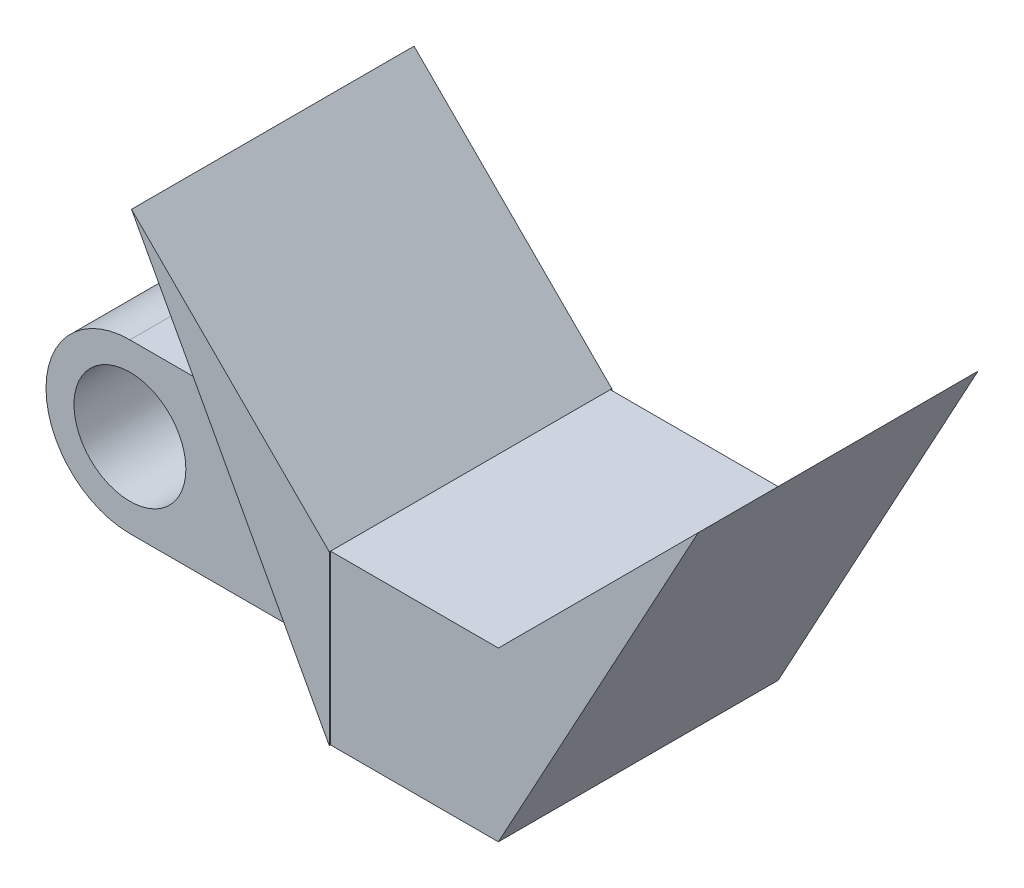
ISO-10303-21;
HEADER;
FILE_DESCRIPTION(('STEP AP214'),'2;1');
FILE_NAME('part.step','',(''),(''),'','','');
FILE_SCHEMA(('AUTOMOTIVE_DESIGN { 1 0 10303 214 1 1 1 1 }'));
ENDSEC;
DATA;
#1=APPLICATION_CONTEXT('core data for automotive mechanical design processes');
#2=APPLICATION_PROTOCOL_DEFINITION('international standard','automotive_design',2000,#1);
#3=PRODUCT_CONTEXT('',#1,'mechanical');
#4=PRODUCT('Part','Part','',(#3));
#5=PRODUCT_RELATED_PRODUCT_CATEGORY('part','',(#4));
#6=PRODUCT_DEFINITION_FORMATION('','',#4);
#7=PRODUCT_DEFINITION_CONTEXT('part definition',#1,'design');
#8=PRODUCT_DEFINITION('design','',#6,#7);
#9=PRODUCT_DEFINITION_SHAPE('','',#8);
#10=(LENGTH_UNIT() NAMED_UNIT(*) SI_UNIT(.MILLI.,.METRE.));
#11=(NAMED_UNIT(*) PLANE_ANGLE_UNIT() SI_UNIT($,.RADIAN.));
#12=(NAMED_UNIT(*) SI_UNIT($,.STERADIAN.) SOLID_ANGLE_UNIT());
#13=UNCERTAINTY_MEASURE_WITH_UNIT(LENGTH_MEASURE(1.E-05),#10,'distance_accuracy_value','');
#14=(GEOMETRIC_REPRESENTATION_CONTEXT(3) GLOBAL_UNCERTAINTY_ASSIGNED_CONTEXT((#13)) GLOBAL_UNIT_ASSIGNED_CONTEXT((#10,
#11,#12)) REPRESENTATION_CONTEXT('',''));
#15=CARTESIAN_POINT('',(0.,0.,0.));
#16=DIRECTION('',(0.,0.,1.));
#17=DIRECTION('',(1.,0.,0.));
#18=AXIS2_PLACEMENT_3D('',#15,#16,#17);
#19=CARTESIAN_POINT('',(6.98523526445291,0.879215927798923,8.72748724976806));
#20=DIRECTION('',(0.,0.,1.));
#21=DIRECTION('',(1.,0.,0.));
#22=AXIS2_PLACEMENT_3D('',#19,#20,#21);
#23=PLANE('',#22);
#24=CARTESIAN_POINT('',(6.98523526445291,0.879215927798923,8.72748724976806));
#25=DIRECTION('',(0.,0.,1.));
#26=DIRECTION('',(1.,0.,0.));
#27=AXIS2_PLACEMENT_3D('',#24,#25,#26);
#28=CIRCLE('',#27,3.75);
#29=CARTESIAN_POINT('',(10.7352352644529,0.879215927798923,8.72748724976806));
#30=VERTEX_POINT('',#29);
#31=EDGE_CURVE('E249',#30,#30,#28,.T.);
#32=ORIENTED_EDGE('',*,*,#31,.F.);
#33=EDGE_LOOP('',(#32));
#34=FACE_BOUND('',#33,.T.);
#35=DIRECTION('',(1.,0.,0.));
#36=VECTOR('',#35,1.);
#37=CARTESIAN_POINT('',(6.98523526445291,-4.74578407220108,8.72748724976806));
#38=LINE('',#37,#36);
#39=CARTESIAN_POINT('',(6.98523526445291,-4.74578407220108,8.72748724976806));
#40=VERTEX_POINT('',#39);
#41=CARTESIAN_POINT('',(25.9745803355988,-4.74578407220108,8.72748724976806));
#42=VERTEX_POINT('',#41);
#43=EDGE_CURVE('E264',#40,#42,#38,.T.);
#44=ORIENTED_EDGE('',*,*,#43,.T.);
#45=DIRECTION('',(-0.475809965540265,0.879548109367857,0.));
#46=VECTOR('',#45,1.);
#47=CARTESIAN_POINT('',(19.321435341387,7.55274165196021,8.72748724976806));
#48=LINE('',#47,#46);
#49=CARTESIAN_POINT('',(19.8886572856645,6.50421592779892,8.72748724976806));
#50=VERTEX_POINT('',#49);
#51=EDGE_CURVE('E68',#42,#50,#48,.T.);
#52=ORIENTED_EDGE('',*,*,#51,.T.);
#53=DIRECTION('',(-1.,0.,0.));
#54=VECTOR('',#53,1.);
#55=CARTESIAN_POINT('',(29.4852352644529,6.50421592779892,8.72748724976806));
#56=LINE('',#55,#54);
#57=CARTESIAN_POINT('',(6.98523526445291,6.50421592779892,8.72748724976806));
#58=VERTEX_POINT('',#57);
#59=EDGE_CURVE('E257',#50,#58,#56,.T.);
#60=ORIENTED_EDGE('',*,*,#59,.T.);
#61=CARTESIAN_POINT('',(6.98523526445291,0.879215927798923,8.72748724976806));
#62=DIRECTION('',(0.,0.,1.));
#63=DIRECTION('',(1.,0.,0.));
#64=AXIS2_PLACEMENT_3D('',#61,#62,#63);
#65=CIRCLE('',#64,5.625);
#66=EDGE_CURVE('E260',#58,#40,#65,.T.);
#67=ORIENTED_EDGE('',*,*,#66,.T.);
#68=EDGE_LOOP('',(#44,#52,#60,#67));
#69=FACE_BOUND('',#68,.T.);
#70=ADVANCED_FACE('F44',(#34,#69),#23,.T.);
#71=CARTESIAN_POINT('',(6.98523526445291,0.879215927798923,1.22748724976807));
#72=DIRECTION('',(0.,0.,1.));
#73=DIRECTION('',(1.,0.,0.));
#74=AXIS2_PLACEMENT_3D('',#71,#72,#73);
#75=PLANE('',#74);
#76=CARTESIAN_POINT('',(6.98523526445291,0.879215927798923,1.22748724976807));
#77=DIRECTION('',(0.,0.,1.));
#78=DIRECTION('',(1.,0.,0.));
#79=AXIS2_PLACEMENT_3D('',#76,#77,#78);
#80=CIRCLE('',#79,3.75);
#81=CARTESIAN_POINT('',(10.7352352644529,0.879215927798923,1.22748724976807));
#82=VERTEX_POINT('',#81);
#83=EDGE_CURVE('E245',#82,#82,#80,.T.);
#84=ORIENTED_EDGE('',*,*,#83,.T.);
#85=EDGE_LOOP('',(#84));
#86=FACE_BOUND('',#85,.T.);
#87=DIRECTION('',(-0.475809965540265,0.879548109367857,0.));
#88=VECTOR('',#87,1.);
#89=CARTESIAN_POINT('',(19.321435341387,7.55274165196021,1.22748724976807));
#90=LINE('',#89,#88);
#91=CARTESIAN_POINT('',(25.9745803355988,-4.74578407220108,1.22748724976807));
#92=VERTEX_POINT('',#91);
#93=CARTESIAN_POINT('',(19.8886572856645,6.50421592779892,1.22748724976807));
#94=VERTEX_POINT('',#93);
#95=EDGE_CURVE('E186',#92,#94,#90,.T.);
#96=ORIENTED_EDGE('',*,*,#95,.F.);
#97=DIRECTION('',(1.,0.,0.));
#98=VECTOR('',#97,1.);
#99=CARTESIAN_POINT('',(29.4852352644529,-4.74578407220108,1.22748724976807));
#100=LINE('',#99,#98);
#101=CARTESIAN_POINT('',(6.98523526445291,-4.74578407220108,1.22748724976807));
#102=VERTEX_POINT('',#101);
#103=EDGE_CURVE('E261',#102,#92,#100,.T.);
#104=ORIENTED_EDGE('',*,*,#103,.F.);
#105=CARTESIAN_POINT('',(6.98523526445291,0.879215927798923,1.22748724976807));
#106=DIRECTION('',(0.,0.,1.));
#107=DIRECTION('',(1.,0.,0.));
#108=AXIS2_PLACEMENT_3D('',#105,#106,#107);
#109=CIRCLE('',#108,5.625);
#110=CARTESIAN_POINT('',(6.98523526445291,6.50421592779892,1.22748724976807));
#111=VERTEX_POINT('',#110);
#112=EDGE_CURVE('E269',#111,#102,#109,.T.);
#113=ORIENTED_EDGE('',*,*,#112,.F.);
#114=DIRECTION('',(-1.,0.,0.));
#115=VECTOR('',#114,1.);
#116=CARTESIAN_POINT('',(6.98523526445291,6.50421592779892,1.22748724976807));
#117=LINE('',#116,#115);
#118=EDGE_CURVE('E253',#94,#111,#117,.T.);
#119=ORIENTED_EDGE('',*,*,#118,.F.);
#120=EDGE_LOOP('',(#96,#104,#113,#119));
#121=FACE_BOUND('',#120,.T.);
#122=ADVANCED_FACE('F289',(#86,#121),#75,.F.);
#123=CARTESIAN_POINT('',(6.98523526445291,6.50421592779892,8.72748724976806));
#124=DIRECTION('',(0.,-1.,0.));
#125=DIRECTION('',(0.,0.,-1.));
#126=AXIS2_PLACEMENT_3D('',#123,#124,#125);
#127=PLANE('',#126);
#128=DIRECTION('',(0.,0.,1.));
#129=VECTOR('',#128,1.);
#130=CARTESIAN_POINT('',(19.8886572856645,6.50421592779892,8.72748724976806));
#131=LINE('',#130,#129);
#132=EDGE_CURVE('E60',#94,#50,#131,.T.);
#133=ORIENTED_EDGE('',*,*,#132,.F.);
#134=ORIENTED_EDGE('',*,*,#118,.T.);
#135=DIRECTION('',(0.,0.,-1.));
#136=VECTOR('',#135,1.);
#137=CARTESIAN_POINT('',(6.98523526445291,6.50421592779892,8.72748724976806));
#138=LINE('',#137,#136);
#139=EDGE_CURVE('E11',#58,#111,#138,.T.);
#140=ORIENTED_EDGE('',*,*,#139,.F.);
#141=ORIENTED_EDGE('',*,*,#59,.F.);
#142=EDGE_LOOP('',(#133,#134,#140,#141));
#143=FACE_BOUND('',#142,.T.);
#144=ADVANCED_FACE('F46',(#143),#127,.F.);
#145=DIRECTION('',(0.,0.,-1.));
#146=VECTOR('',#145,1.);
#147=CARTESIAN_POINT('',(25.9745803355988,6.50421592779893,14.2699872497681));
#148=LINE('',#147,#146);
#149=CARTESIAN_POINT('',(25.9745803355988,6.50421592779893,14.2699872497681));
#150=VERTEX_POINT('',#149);
#151=CARTESIAN_POINT('',(25.9745803355988,6.50421592779893,-4.48001275023193));
#152=VERTEX_POINT('',#151);
#153=EDGE_CURVE('E212',#150,#152,#148,.T.);
#154=ORIENTED_EDGE('',*,*,#153,.F.);
#155=DIRECTION('',(-1.,0.,0.));
#156=VECTOR('',#155,1.);
#157=CARTESIAN_POINT('',(25.9745803355988,6.50421592779893,14.2699872497681));
#158=LINE('',#157,#156);
#159=CARTESIAN_POINT('',(37.2245803355988,6.50421592779893,14.2699872497681));
#160=VERTEX_POINT('',#159);
#161=EDGE_CURVE('E225',#160,#150,#158,.T.);
#162=ORIENTED_EDGE('',*,*,#161,.F.);
#163=DIRECTION('',(0.,0.,1.));
#164=VECTOR('',#163,1.);
#165=CARTESIAN_POINT('',(37.2245803355988,6.50421592779893,14.2699872497681));
#166=LINE('',#165,#164);
#167=CARTESIAN_POINT('',(37.2245803355988,6.50421592779893,-4.48001275023193));
#168=VERTEX_POINT('',#167);
#169=EDGE_CURVE('E221',#168,#160,#166,.T.);
#170=ORIENTED_EDGE('',*,*,#169,.F.);
#171=DIRECTION('',(1.,0.,0.));
#172=VECTOR('',#171,1.);
#173=CARTESIAN_POINT('',(25.9745803355988,6.50421592779893,-4.48001275023193));
#174=LINE('',#173,#172);
#175=EDGE_CURVE('E216',#152,#168,#174,.T.);
#176=ORIENTED_EDGE('',*,*,#175,.F.);
#177=EDGE_LOOP('',(#154,#162,#170,#176));
#178=FACE_BOUND('',#177,.T.);
#179=ADVANCED_FACE('F303',(#178),#127,.F.);
#180=CARTESIAN_POINT('',(6.98523526445291,0.879215927798923,8.72748724976806));
#181=DIRECTION('',(0.,0.,-1.));
#182=DIRECTION('',(-1.,0.,0.));
#183=AXIS2_PLACEMENT_3D('',#180,#181,#182);
#184=CYLINDRICAL_SURFACE('',#183,5.625);
#185=ORIENTED_EDGE('',*,*,#112,.T.);
#186=DIRECTION('',(0.,0.,-1.));
#187=VECTOR('',#186,1.);
#188=CARTESIAN_POINT('',(6.98523526445291,-4.74578407220108,8.72748724976806));
#189=LINE('',#188,#187);
#190=EDGE_CURVE('E53',#40,#102,#189,.T.);
#191=ORIENTED_EDGE('',*,*,#190,.F.);
#192=ORIENTED_EDGE('',*,*,#66,.F.);
#193=ORIENTED_EDGE('',*,*,#139,.T.);
#194=EDGE_LOOP('',(#185,#191,#192,#193));
#195=FACE_BOUND('',#194,.T.);
#196=ADVANCED_FACE('F285',(#195),#184,.T.);
#197=CARTESIAN_POINT('',(29.4852352644529,-4.74578407220108,8.72748724976806));
#198=DIRECTION('',(0.,1.,0.));
#199=DIRECTION('',(0.,0.,1.));
#200=AXIS2_PLACEMENT_3D('',#197,#198,#199);
#201=PLANE('',#200);
#202=DIRECTION('',(0.,0.,-1.));
#203=VECTOR('',#202,1.);
#204=CARTESIAN_POINT('',(25.9745803355988,-4.74578407220108,14.2699872497681));
#205=LINE('',#204,#203);
#206=CARTESIAN_POINT('',(25.9745803355988,-4.74578407220108,14.2699872497681));
#207=VERTEX_POINT('',#206);
#208=EDGE_CURVE('E142',#207,#42,#205,.T.);
#209=ORIENTED_EDGE('',*,*,#208,.T.);
#210=ORIENTED_EDGE('',*,*,#43,.F.);
#211=ORIENTED_EDGE('',*,*,#190,.T.);
#212=ORIENTED_EDGE('',*,*,#103,.T.);
#213=CARTESIAN_POINT('',(25.9745803355988,-4.74578407220108,-4.48001275023193));
#214=VERTEX_POINT('',#213);
#215=EDGE_CURVE('E211',#92,#214,#205,.T.);
#216=ORIENTED_EDGE('',*,*,#215,.T.);
#217=DIRECTION('',(1.,0.,0.));
#218=VECTOR('',#217,1.);
#219=CARTESIAN_POINT('',(25.9745803355988,-4.74578407220108,-4.48001275023193));
#220=LINE('',#219,#218);
#221=CARTESIAN_POINT('',(37.2245803355988,-4.74578407220108,-4.48001275023193));
#222=VERTEX_POINT('',#221);
#223=EDGE_CURVE('E232',#214,#222,#220,.T.);
#224=ORIENTED_EDGE('',*,*,#223,.T.);
#225=DIRECTION('',(0.,0.,1.));
#226=VECTOR('',#225,1.);
#227=CARTESIAN_POINT('',(37.2245803355988,-4.74578407220108,14.2699872497681));
#228=LINE('',#227,#226);
#229=CARTESIAN_POINT('',(37.2245803355988,-4.74578407220108,14.2699872497681));
#230=VERTEX_POINT('',#229);
#231=EDGE_CURVE('E235',#222,#230,#228,.T.);
#232=ORIENTED_EDGE('',*,*,#231,.T.);
#233=DIRECTION('',(-1.,0.,0.));
#234=VECTOR('',#233,1.);
#235=CARTESIAN_POINT('',(25.9745803355988,-4.74578407220108,14.2699872497681));
#236=LINE('',#235,#234);
#237=EDGE_CURVE('E217',#230,#207,#236,.T.);
#238=ORIENTED_EDGE('',*,*,#237,.T.);
#239=EDGE_LOOP('',(#209,#210,#211,#212,#216,#224,#232,#238));
#240=FACE_BOUND('',#239,.T.);
#241=ADVANCED_FACE('F280',(#240),#201,.F.);
#242=CARTESIAN_POINT('',(6.98523526445291,0.879215927798923,8.72748724976806));
#243=DIRECTION('',(0.,0.,-1.));
#244=DIRECTION('',(-1.,0.,0.));
#245=AXIS2_PLACEMENT_3D('',#242,#243,#244);
#246=CYLINDRICAL_SURFACE('',#245,3.75);
#247=ORIENTED_EDGE('',*,*,#31,.T.);
#248=EDGE_LOOP('',(#247));
#249=FACE_BOUND('',#248,.T.);
#250=ORIENTED_EDGE('',*,*,#83,.F.);
#251=EDGE_LOOP('',(#250));
#252=FACE_BOUND('',#251,.T.);
#253=ADVANCED_FACE('F327',(#249,#252),#246,.F.);
#254=CARTESIAN_POINT('',(25.9745803355988,6.50421592779893,14.2699872497681));
#255=DIRECTION('',(0.,0.,1.));
#256=DIRECTION('',(1.,0.,0.));
#257=AXIS2_PLACEMENT_3D('',#254,#255,#256);
#258=PLANE('',#257);
#259=ORIENTED_EDGE('',*,*,#237,.F.);
#260=DIRECTION('',(-0.477595392948132,-0.878579899971949,0.));
#261=VECTOR('',#260,1.);
#262=CARTESIAN_POINT('',(50.6239712760256,19.9036068682256,14.2699872497681));
#263=LINE('',#262,#261);
#264=CARTESIAN_POINT('',(50.6239712760256,19.9036068682256,14.2699872497681));
#265=VERTEX_POINT('',#264);
#266=EDGE_CURVE('E197',#265,#230,#263,.T.);
#267=ORIENTED_EDGE('',*,*,#266,.F.);
#268=DIRECTION('',(0.707106781186551,0.707106781186544,0.));
#269=VECTOR('',#268,1.);
#270=CARTESIAN_POINT('',(37.2245803355988,6.50421592779893,14.2699872497681));
#271=LINE('',#270,#269);
#272=EDGE_CURVE('E193',#160,#265,#271,.T.);
#273=ORIENTED_EDGE('',*,*,#272,.F.);
#274=ORIENTED_EDGE('',*,*,#161,.T.);
#275=DIRECTION('',(0.,-1.,0.));
#276=VECTOR('',#275,1.);
#277=CARTESIAN_POINT('',(25.9745803355988,6.50421592779893,14.2699872497681));
#278=LINE('',#277,#276);
#279=EDGE_CURVE('E242',#150,#207,#278,.T.);
#280=ORIENTED_EDGE('',*,*,#279,.T.);
#281=EDGE_LOOP('',(#259,#267,#273,#274,#280));
#282=FACE_BOUND('',#281,.T.);
#283=ADVANCED_FACE('F417',(#282),#258,.T.);
#284=CARTESIAN_POINT('',(25.9745803355988,6.50421592779893,-4.48001275023193));
#285=DIRECTION('',(0.,0.,-1.));
#286=DIRECTION('',(-1.,0.,0.));
#287=AXIS2_PLACEMENT_3D('',#284,#285,#286);
#288=PLANE('',#287);
#289=ORIENTED_EDGE('',*,*,#223,.F.);
#290=DIRECTION('',(0.,-1.,0.));
#291=VECTOR('',#290,1.);
#292=CARTESIAN_POINT('',(25.9745803355988,6.50421592779893,-4.48001275023193));
#293=LINE('',#292,#291);
#294=EDGE_CURVE('E229',#152,#214,#293,.T.);
#295=ORIENTED_EDGE('',*,*,#294,.F.);
#296=ORIENTED_EDGE('',*,*,#175,.T.);
#297=DIRECTION('',(0.707106781186551,0.707106781186544,0.));
#298=VECTOR('',#297,1.);
#299=CARTESIAN_POINT('',(37.2245803355988,6.50421592779893,-4.48001275023193));
#300=LINE('',#299,#298);
#301=CARTESIAN_POINT('',(50.6239712760256,19.9036068682256,-4.48001275023193));
#302=VERTEX_POINT('',#301);
#303=EDGE_CURVE('E192',#168,#302,#300,.T.);
#304=ORIENTED_EDGE('',*,*,#303,.T.);
#305=DIRECTION('',(-0.477595392948132,-0.878579899971949,0.));
#306=VECTOR('',#305,1.);
#307=CARTESIAN_POINT('',(50.6239712760256,19.9036068682256,-4.48001275023193));
#308=LINE('',#307,#306);
#309=EDGE_CURVE('E198',#302,#222,#308,.T.);
#310=ORIENTED_EDGE('',*,*,#309,.T.);
#311=EDGE_LOOP('',(#289,#295,#296,#304,#310));
#312=FACE_BOUND('',#311,.T.);
#313=ADVANCED_FACE('F300',(#312),#288,.T.);
#314=CARTESIAN_POINT('',(50.6239712760256,19.9036068682256,14.2699872497681));
#315=DIRECTION('',(0.878579899971949,-0.477595392948132,0.));
#316=DIRECTION('',(0.477595392948132,0.878579899971949,0.));
#317=AXIS2_PLACEMENT_3D('',#314,#315,#316);
#318=PLANE('',#317);
#319=ORIENTED_EDGE('',*,*,#309,.F.);
#320=DIRECTION('',(0.,0.,-1.));
#321=VECTOR('',#320,1.);
#322=CARTESIAN_POINT('',(50.6239712760256,19.9036068682256,14.2699872497681));
#323=LINE('',#322,#321);
#324=EDGE_CURVE('E202',#265,#302,#323,.T.);
#325=ORIENTED_EDGE('',*,*,#324,.F.);
#326=ORIENTED_EDGE('',*,*,#266,.T.);
#327=ORIENTED_EDGE('',*,*,#231,.F.);
#328=EDGE_LOOP('',(#319,#325,#326,#327));
#329=FACE_BOUND('',#328,.T.);
#330=ADVANCED_FACE('F416',(#329),#318,.T.);
#331=CARTESIAN_POINT('',(37.2245803355988,6.50421592779893,14.2699872497681));
#332=DIRECTION('',(-0.707106781186544,0.707106781186551,0.));
#333=DIRECTION('',(-0.707106781186551,-0.707106781186544,0.));
#334=AXIS2_PLACEMENT_3D('',#331,#332,#333);
#335=PLANE('',#334);
#336=ORIENTED_EDGE('',*,*,#303,.F.);
#337=ORIENTED_EDGE('',*,*,#169,.T.);
#338=ORIENTED_EDGE('',*,*,#272,.T.);
#339=ORIENTED_EDGE('',*,*,#324,.T.);
#340=EDGE_LOOP('',(#336,#337,#338,#339));
#341=FACE_BOUND('',#340,.T.);
#342=ADVANCED_FACE('F390',(#341),#335,.T.);
#343=CARTESIAN_POINT('',(25.9745803355988,6.50421592779893,-4.58501275023194));
#344=DIRECTION('',(-1.,0.,0.));
#345=DIRECTION('',(0.,0.,1.));
#346=AXIS2_PLACEMENT_3D('',#343,#344,#345);
#347=PLANE('',#346);
#348=ORIENTED_EDGE('',*,*,#279,.F.);
#349=DIRECTION('',(0.,0.,1.));
#350=VECTOR('',#349,1.);
#351=CARTESIAN_POINT('',(25.9745803355988,6.50421592779893,-4.58501275023194));
#352=LINE('',#351,#350);
#353=CARTESIAN_POINT('',(25.9745803355988,6.50421592779893,14.3524872497681));
#354=VERTEX_POINT('',#353);
#355=EDGE_CURVE('E160',#150,#354,#352,.T.);
#356=ORIENTED_EDGE('',*,*,#355,.T.);
#357=DIRECTION('',(0.,-1.,0.));
#358=VECTOR('',#357,1.);
#359=CARTESIAN_POINT('',(25.9745803355988,6.50421592779893,14.3524872497681));
#360=LINE('',#359,#358);
#361=CARTESIAN_POINT('',(25.9745803355988,-4.74578407220108,14.3524872497681));
#362=VERTEX_POINT('',#361);
#363=EDGE_CURVE('E153',#354,#362,#360,.T.);
#364=ORIENTED_EDGE('',*,*,#363,.T.);
#365=DIRECTION('',(0.,0.,1.));
#366=VECTOR('',#365,1.);
#367=CARTESIAN_POINT('',(25.9745803355988,-4.74578407220108,-4.58501275023194));
#368=LINE('',#367,#366);
#369=EDGE_CURVE('E135',#207,#362,#368,.T.);
#370=ORIENTED_EDGE('',*,*,#369,.F.);
#371=EDGE_LOOP('',(#348,#356,#364,#370));
#372=FACE_BOUND('',#371,.T.);
#373=ADVANCED_FACE('F158',(#372),#347,.F.);
#374=ORIENTED_EDGE('',*,*,#294,.T.);
#375=CARTESIAN_POINT('',(25.9745803355988,-4.74578407220108,-4.58501275023194));
#376=VERTEX_POINT('',#375);
#377=EDGE_CURVE('E147',#376,#214,#368,.T.);
#378=ORIENTED_EDGE('',*,*,#377,.F.);
#379=DIRECTION('',(0.,-1.,0.));
#380=VECTOR('',#379,1.);
#381=CARTESIAN_POINT('',(25.9745803355988,6.50421592779893,-4.58501275023194));
#382=LINE('',#381,#380);
#383=CARTESIAN_POINT('',(25.9745803355988,6.50421592779893,-4.58501275023194));
#384=VERTEX_POINT('',#383);
#385=EDGE_CURVE('E166',#384,#376,#382,.T.);
#386=ORIENTED_EDGE('',*,*,#385,.F.);
#387=EDGE_CURVE('E176',#384,#152,#352,.T.);
#388=ORIENTED_EDGE('',*,*,#387,.T.);
#389=EDGE_LOOP('',(#374,#378,#386,#388));
#390=FACE_BOUND('',#389,.T.);
#391=ADVANCED_FACE('F295',(#390),#347,.F.);
#392=CARTESIAN_POINT('',(12.7163281883511,19.7624680750467,-4.58501275023194));
#393=DIRECTION('',(0.879548109367857,0.475809965540265,0.));
#394=DIRECTION('',(-0.475809965540265,0.879548109367857,0.));
#395=AXIS2_PLACEMENT_3D('',#392,#393,#394);
#396=PLANE('',#395);
#397=ORIENTED_EDGE('',*,*,#51,.F.);
#398=ORIENTED_EDGE('',*,*,#208,.F.);
#399=ORIENTED_EDGE('',*,*,#369,.T.);
#400=DIRECTION('',(-0.475809965540265,0.879548109367857,0.));
#401=VECTOR('',#400,1.);
#402=CARTESIAN_POINT('',(12.7163281883511,19.7624680750467,14.3524872497681));
#403=LINE('',#402,#401);
#404=CARTESIAN_POINT('',(12.7163281883511,19.7624680750467,14.3524872497681));
#405=VERTEX_POINT('',#404);
#406=EDGE_CURVE('E139',#362,#405,#403,.T.);
#407=ORIENTED_EDGE('',*,*,#406,.T.);
#408=DIRECTION('',(0.,0.,1.));
#409=VECTOR('',#408,1.);
#410=CARTESIAN_POINT('',(12.7163281883511,19.7624680750467,-4.58501275023194));
#411=LINE('',#410,#409);
#412=CARTESIAN_POINT('',(12.7163281883511,19.7624680750467,-4.58501275023194));
#413=VERTEX_POINT('',#412);
#414=EDGE_CURVE('E148',#413,#405,#411,.T.);
#415=ORIENTED_EDGE('',*,*,#414,.F.);
#416=DIRECTION('',(-0.475809965540265,0.879548109367857,0.));
#417=VECTOR('',#416,1.);
#418=CARTESIAN_POINT('',(12.7163281883511,19.7624680750467,-4.58501275023194));
#419=LINE('',#418,#417);
#420=EDGE_CURVE('E170',#376,#413,#419,.T.);
#421=ORIENTED_EDGE('',*,*,#420,.F.);
#422=ORIENTED_EDGE('',*,*,#377,.T.);
#423=ORIENTED_EDGE('',*,*,#215,.F.);
#424=ORIENTED_EDGE('',*,*,#95,.T.);
#425=ORIENTED_EDGE('',*,*,#132,.T.);
#426=EDGE_LOOP('',(#397,#398,#399,#407,#415,#421,#422,#423,#424,#425));
#427=FACE_BOUND('',#426,.T.);
#428=ADVANCED_FACE('F137',(#427),#396,.F.);
#429=CARTESIAN_POINT('',(25.9745803355988,6.50421592779893,-4.58501275023194));
#430=DIRECTION('',(-0.707106781186549,-0.707106781186546,0.));
#431=DIRECTION('',(0.707106781186546,-0.707106781186549,0.));
#432=AXIS2_PLACEMENT_3D('',#429,#430,#431);
#433=PLANE('',#432);
#434=ORIENTED_EDGE('',*,*,#414,.T.);
#435=DIRECTION('',(0.707106781186546,-0.707106781186549,0.));
#436=VECTOR('',#435,1.);
#437=CARTESIAN_POINT('',(25.9745803355988,6.50421592779893,14.3524872497681));
#438=LINE('',#437,#436);
#439=EDGE_CURVE('E155',#405,#354,#438,.T.);
#440=ORIENTED_EDGE('',*,*,#439,.T.);
#441=ORIENTED_EDGE('',*,*,#355,.F.);
#442=ORIENTED_EDGE('',*,*,#153,.T.);
#443=ORIENTED_EDGE('',*,*,#387,.F.);
#444=DIRECTION('',(0.707106781186546,-0.707106781186549,0.));
#445=VECTOR('',#444,1.);
#446=CARTESIAN_POINT('',(25.9745803355988,6.50421592779893,-4.58501275023194));
#447=LINE('',#446,#445);
#448=EDGE_CURVE('E173',#413,#384,#447,.T.);
#449=ORIENTED_EDGE('',*,*,#448,.F.);
#450=EDGE_LOOP('',(#434,#440,#441,#442,#443,#449));
#451=FACE_BOUND('',#450,.T.);
#452=ADVANCED_FACE('F305',(#451),#433,.F.);
#453=CARTESIAN_POINT('',(6.98523526445291,0.879215927798923,-4.58501275023194));
#454=DIRECTION('',(0.,0.,-1.));
#455=DIRECTION('',(-1.,0.,0.));
#456=AXIS2_PLACEMENT_3D('',#453,#454,#455);
#457=PLANE('',#456);
#458=ORIENTED_EDGE('',*,*,#385,.T.);
#459=ORIENTED_EDGE('',*,*,#420,.T.);
#460=ORIENTED_EDGE('',*,*,#448,.T.);
#461=EDGE_LOOP('',(#458,#459,#460));
#462=FACE_BOUND('',#461,.T.);
#463=ADVANCED_FACE('F308',(#462),#457,.T.);
#464=CARTESIAN_POINT('',(6.98523526445291,0.879215927798923,14.3524872497681));
#465=DIRECTION('',(0.,0.,-1.));
#466=DIRECTION('',(-1.,0.,0.));
#467=AXIS2_PLACEMENT_3D('',#464,#465,#466);
#468=PLANE('',#467);
#469=ORIENTED_EDGE('',*,*,#363,.F.);
#470=ORIENTED_EDGE('',*,*,#439,.F.);
#471=ORIENTED_EDGE('',*,*,#406,.F.);
#472=EDGE_LOOP('',(#469,#470,#471));
#473=FACE_BOUND('',#472,.T.);
#474=ADVANCED_FACE('F152',(#473),#468,.F.);
#475=CLOSED_SHELL('',(#70,#122,#144,#179,#196,#241,#253,#283,#313,#330,#342,#373,#391,#428,#452,
#463,#474));
#476=MANIFOLD_SOLID_BREP('B2',#475);
#477=ADVANCED_BREP_SHAPE_REPRESENTATION('',(#18,#476),#14);
#478=SHAPE_DEFINITION_REPRESENTATION(#9,#477);
ENDSEC;
END-ISO-10303-21;
